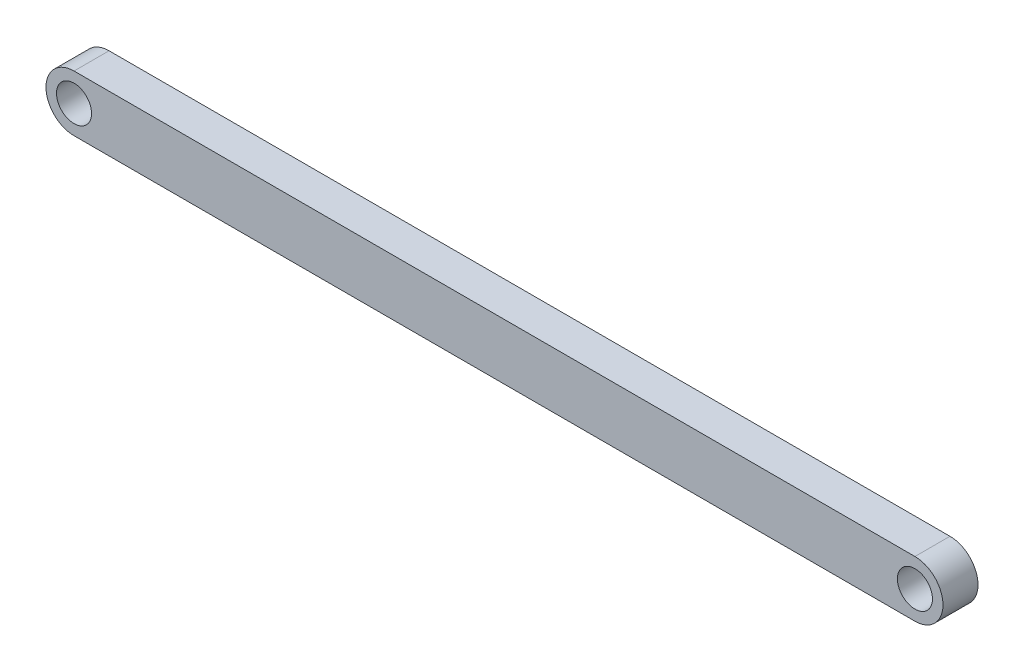
ISO-10303-21;
HEADER;
FILE_DESCRIPTION(('STEP AP214'),'2;1');
FILE_NAME('part.step','',(''),(''),'','','');
FILE_SCHEMA(('AUTOMOTIVE_DESIGN { 1 0 10303 214 1 1 1 1 }'));
ENDSEC;
DATA;
#1=APPLICATION_CONTEXT('core data for automotive mechanical design processes');
#2=APPLICATION_PROTOCOL_DEFINITION('international standard','automotive_design',2000,#1);
#3=PRODUCT_CONTEXT('',#1,'mechanical');
#4=PRODUCT('Part','Part','',(#3));
#5=PRODUCT_RELATED_PRODUCT_CATEGORY('part','',(#4));
#6=PRODUCT_DEFINITION_FORMATION('','',#4);
#7=PRODUCT_DEFINITION_CONTEXT('part definition',#1,'design');
#8=PRODUCT_DEFINITION('design','',#6,#7);
#9=PRODUCT_DEFINITION_SHAPE('','',#8);
#10=(LENGTH_UNIT() NAMED_UNIT(*) SI_UNIT(.MILLI.,.METRE.));
#11=(NAMED_UNIT(*) PLANE_ANGLE_UNIT() SI_UNIT($,.RADIAN.));
#12=(NAMED_UNIT(*) SI_UNIT($,.STERADIAN.) SOLID_ANGLE_UNIT());
#13=UNCERTAINTY_MEASURE_WITH_UNIT(LENGTH_MEASURE(1.E-05),#10,'distance_accuracy_value','');
#14=(GEOMETRIC_REPRESENTATION_CONTEXT(3) GLOBAL_UNCERTAINTY_ASSIGNED_CONTEXT((#13)) GLOBAL_UNIT_ASSIGNED_CONTEXT((#10,
#11,#12)) REPRESENTATION_CONTEXT('',''));
#15=CARTESIAN_POINT('',(0.,0.,0.));
#16=DIRECTION('',(0.,0.,1.));
#17=DIRECTION('',(1.,0.,0.));
#18=AXIS2_PLACEMENT_3D('',#15,#16,#17);
#19=CARTESIAN_POINT('',(0.,0.,10.));
#20=DIRECTION('',(0.,0.,1.));
#21=DIRECTION('',(1.,0.,0.));
#22=AXIS2_PLACEMENT_3D('',#19,#20,#21);
#23=PLANE('',#22);
#24=CARTESIAN_POINT('',(240.,0.,10.));
#25=DIRECTION('',(0.,0.,1.));
#26=DIRECTION('',(1.,0.,0.));
#27=AXIS2_PLACEMENT_3D('',#24,#25,#26);
#28=CIRCLE('',#27,4.99999999999999);
#29=CARTESIAN_POINT('',(245.,0.,10.));
#30=VERTEX_POINT('',#29);
#31=EDGE_CURVE('E104',#30,#30,#28,.T.);
#32=ORIENTED_EDGE('',*,*,#31,.F.);
#33=EDGE_LOOP('',(#32));
#34=FACE_BOUND('',#33,.T.);
#35=CARTESIAN_POINT('',(0.,0.,10.));
#36=DIRECTION('',(0.,0.,1.));
#37=DIRECTION('',(1.,0.,0.));
#38=AXIS2_PLACEMENT_3D('',#35,#36,#37);
#39=CIRCLE('',#38,8.);
#40=CARTESIAN_POINT('',(0.,8.,10.));
#41=VERTEX_POINT('',#40);
#42=CARTESIAN_POINT('',(0.,-8.,10.));
#43=VERTEX_POINT('',#42);
#44=EDGE_CURVE('E89',#41,#43,#39,.T.);
#45=ORIENTED_EDGE('',*,*,#44,.T.);
#46=DIRECTION('',(1.,0.,0.));
#47=VECTOR('',#46,1.);
#48=CARTESIAN_POINT('',(0.,-8.,10.));
#49=LINE('',#48,#47);
#50=CARTESIAN_POINT('',(240.,-8.,10.));
#51=VERTEX_POINT('',#50);
#52=EDGE_CURVE('E84',#43,#51,#49,.T.);
#53=ORIENTED_EDGE('',*,*,#52,.T.);
#54=CARTESIAN_POINT('',(240.,0.,10.));
#55=DIRECTION('',(0.,0.,1.));
#56=DIRECTION('',(1.,0.,0.));
#57=AXIS2_PLACEMENT_3D('',#54,#55,#56);
#58=CIRCLE('',#57,8.);
#59=CARTESIAN_POINT('',(240.,8.,10.));
#60=VERTEX_POINT('',#59);
#61=EDGE_CURVE('E87',#51,#60,#58,.T.);
#62=ORIENTED_EDGE('',*,*,#61,.T.);
#63=DIRECTION('',(-1.,0.,0.));
#64=VECTOR('',#63,1.);
#65=CARTESIAN_POINT('',(0.,8.,10.));
#66=LINE('',#65,#64);
#67=EDGE_CURVE('E54',#60,#41,#66,.T.);
#68=ORIENTED_EDGE('',*,*,#67,.T.);
#69=EDGE_LOOP('',(#45,#53,#62,#68));
#70=FACE_BOUND('',#69,.T.);
#71=CARTESIAN_POINT('',(0.,0.,10.));
#72=DIRECTION('',(0.,0.,1.));
#73=DIRECTION('',(1.,0.,0.));
#74=AXIS2_PLACEMENT_3D('',#71,#72,#73);
#75=CIRCLE('',#74,5.);
#76=CARTESIAN_POINT('',(5.,0.,10.));
#77=VERTEX_POINT('',#76);
#78=EDGE_CURVE('E119',#77,#77,#75,.T.);
#79=ORIENTED_EDGE('',*,*,#78,.F.);
#80=EDGE_LOOP('',(#79));
#81=FACE_BOUND('',#80,.T.);
#82=ADVANCED_FACE('F37',(#34,#70,#81),#23,.T.);
#83=CARTESIAN_POINT('',(0.,0.,0.));
#84=DIRECTION('',(0.,0.,1.));
#85=DIRECTION('',(1.,0.,0.));
#86=AXIS2_PLACEMENT_3D('',#83,#84,#85);
#87=PLANE('',#86);
#88=CARTESIAN_POINT('',(0.,0.,0.));
#89=DIRECTION('',(0.,0.,1.));
#90=DIRECTION('',(1.,0.,0.));
#91=AXIS2_PLACEMENT_3D('',#88,#89,#90);
#92=CIRCLE('',#91,8.);
#93=CARTESIAN_POINT('',(0.,8.,0.));
#94=VERTEX_POINT('',#93);
#95=CARTESIAN_POINT('',(0.,-8.,0.));
#96=VERTEX_POINT('',#95);
#97=EDGE_CURVE('E101',#94,#96,#92,.T.);
#98=ORIENTED_EDGE('',*,*,#97,.F.);
#99=DIRECTION('',(-1.,0.,0.));
#100=VECTOR('',#99,1.);
#101=CARTESIAN_POINT('',(0.,8.,0.));
#102=LINE('',#101,#100);
#103=CARTESIAN_POINT('',(240.,8.,0.));
#104=VERTEX_POINT('',#103);
#105=EDGE_CURVE('E77',#104,#94,#102,.T.);
#106=ORIENTED_EDGE('',*,*,#105,.F.);
#107=CARTESIAN_POINT('',(240.,0.,0.));
#108=DIRECTION('',(0.,0.,1.));
#109=DIRECTION('',(1.,0.,0.));
#110=AXIS2_PLACEMENT_3D('',#107,#108,#109);
#111=CIRCLE('',#110,8.);
#112=CARTESIAN_POINT('',(240.,-8.,0.));
#113=VERTEX_POINT('',#112);
#114=EDGE_CURVE('E71',#113,#104,#111,.T.);
#115=ORIENTED_EDGE('',*,*,#114,.F.);
#116=DIRECTION('',(1.,0.,0.));
#117=VECTOR('',#116,1.);
#118=CARTESIAN_POINT('',(0.,-8.,0.));
#119=LINE('',#118,#117);
#120=EDGE_CURVE('E93',#96,#113,#119,.T.);
#121=ORIENTED_EDGE('',*,*,#120,.F.);
#122=EDGE_LOOP('',(#98,#106,#115,#121));
#123=FACE_BOUND('',#122,.T.);
#124=CARTESIAN_POINT('',(240.,0.,0.));
#125=DIRECTION('',(0.,0.,1.));
#126=DIRECTION('',(1.,0.,0.));
#127=AXIS2_PLACEMENT_3D('',#124,#125,#126);
#128=CIRCLE('',#127,4.99999999999999);
#129=CARTESIAN_POINT('',(245.,0.,0.));
#130=VERTEX_POINT('',#129);
#131=EDGE_CURVE('E116',#130,#130,#128,.T.);
#132=ORIENTED_EDGE('',*,*,#131,.T.);
#133=EDGE_LOOP('',(#132));
#134=FACE_BOUND('',#133,.T.);
#135=CARTESIAN_POINT('',(0.,0.,0.));
#136=DIRECTION('',(0.,0.,1.));
#137=DIRECTION('',(1.,0.,0.));
#138=AXIS2_PLACEMENT_3D('',#135,#136,#137);
#139=CIRCLE('',#138,5.);
#140=CARTESIAN_POINT('',(5.,0.,0.));
#141=VERTEX_POINT('',#140);
#142=EDGE_CURVE('E122',#141,#141,#139,.T.);
#143=ORIENTED_EDGE('',*,*,#142,.T.);
#144=EDGE_LOOP('',(#143));
#145=FACE_BOUND('',#144,.T.);
#146=ADVANCED_FACE('F112',(#123,#134,#145),#87,.F.);
#147=CARTESIAN_POINT('',(0.,0.,10.));
#148=DIRECTION('',(0.,0.,-1.));
#149=DIRECTION('',(-1.,0.,0.));
#150=AXIS2_PLACEMENT_3D('',#147,#148,#149);
#151=CYLINDRICAL_SURFACE('',#150,8.);
#152=ORIENTED_EDGE('',*,*,#97,.T.);
#153=DIRECTION('',(0.,0.,-1.));
#154=VECTOR('',#153,1.);
#155=CARTESIAN_POINT('',(0.,-8.,10.));
#156=LINE('',#155,#154);
#157=EDGE_CURVE('E11',#43,#96,#156,.T.);
#158=ORIENTED_EDGE('',*,*,#157,.F.);
#159=ORIENTED_EDGE('',*,*,#44,.F.);
#160=DIRECTION('',(0.,0.,-1.));
#161=VECTOR('',#160,1.);
#162=CARTESIAN_POINT('',(0.,8.,10.));
#163=LINE('',#162,#161);
#164=EDGE_CURVE('E97',#41,#94,#163,.T.);
#165=ORIENTED_EDGE('',*,*,#164,.T.);
#166=EDGE_LOOP('',(#152,#158,#159,#165));
#167=FACE_BOUND('',#166,.T.);
#168=ADVANCED_FACE('F39',(#167),#151,.T.);
#169=CARTESIAN_POINT('',(0.,-8.,10.));
#170=DIRECTION('',(0.,1.,0.));
#171=DIRECTION('',(0.,0.,1.));
#172=AXIS2_PLACEMENT_3D('',#169,#170,#171);
#173=PLANE('',#172);
#174=ORIENTED_EDGE('',*,*,#120,.T.);
#175=DIRECTION('',(0.,0.,-1.));
#176=VECTOR('',#175,1.);
#177=CARTESIAN_POINT('',(240.,-8.,10.));
#178=LINE('',#177,#176);
#179=EDGE_CURVE('E46',#51,#113,#178,.T.);
#180=ORIENTED_EDGE('',*,*,#179,.F.);
#181=ORIENTED_EDGE('',*,*,#52,.F.);
#182=ORIENTED_EDGE('',*,*,#157,.T.);
#183=EDGE_LOOP('',(#174,#180,#181,#182));
#184=FACE_BOUND('',#183,.T.);
#185=ADVANCED_FACE('F92',(#184),#173,.F.);
#186=CARTESIAN_POINT('',(240.,0.,10.));
#187=DIRECTION('',(0.,0.,-1.));
#188=DIRECTION('',(-1.,0.,0.));
#189=AXIS2_PLACEMENT_3D('',#186,#187,#188);
#190=CYLINDRICAL_SURFACE('',#189,8.);
#191=ORIENTED_EDGE('',*,*,#114,.T.);
#192=DIRECTION('',(0.,0.,-1.));
#193=VECTOR('',#192,1.);
#194=CARTESIAN_POINT('',(240.,8.,10.));
#195=LINE('',#194,#193);
#196=EDGE_CURVE('E94',#60,#104,#195,.T.);
#197=ORIENTED_EDGE('',*,*,#196,.F.);
#198=ORIENTED_EDGE('',*,*,#61,.F.);
#199=ORIENTED_EDGE('',*,*,#179,.T.);
#200=EDGE_LOOP('',(#191,#197,#198,#199));
#201=FACE_BOUND('',#200,.T.);
#202=ADVANCED_FACE('F95',(#201),#190,.T.);
#203=CARTESIAN_POINT('',(0.,8.,10.));
#204=DIRECTION('',(0.,-1.,0.));
#205=DIRECTION('',(0.,0.,-1.));
#206=AXIS2_PLACEMENT_3D('',#203,#204,#205);
#207=PLANE('',#206);
#208=ORIENTED_EDGE('',*,*,#105,.T.);
#209=ORIENTED_EDGE('',*,*,#164,.F.);
#210=ORIENTED_EDGE('',*,*,#67,.F.);
#211=ORIENTED_EDGE('',*,*,#196,.T.);
#212=EDGE_LOOP('',(#208,#209,#210,#211));
#213=FACE_BOUND('',#212,.T.);
#214=ADVANCED_FACE('F109',(#213),#207,.F.);
#215=CARTESIAN_POINT('',(240.,0.,10.));
#216=DIRECTION('',(0.,0.,-1.));
#217=DIRECTION('',(-1.,0.,0.));
#218=AXIS2_PLACEMENT_3D('',#215,#216,#217);
#219=CYLINDRICAL_SURFACE('',#218,4.99999999999999);
#220=ORIENTED_EDGE('',*,*,#31,.T.);
#221=EDGE_LOOP('',(#220));
#222=FACE_BOUND('',#221,.T.);
#223=ORIENTED_EDGE('',*,*,#131,.F.);
#224=EDGE_LOOP('',(#223));
#225=FACE_BOUND('',#224,.T.);
#226=ADVANCED_FACE('F139',(#222,#225),#219,.F.);
#227=CARTESIAN_POINT('',(0.,0.,10.));
#228=DIRECTION('',(0.,0.,-1.));
#229=DIRECTION('',(-1.,0.,0.));
#230=AXIS2_PLACEMENT_3D('',#227,#228,#229);
#231=CYLINDRICAL_SURFACE('',#230,5.);
#232=ORIENTED_EDGE('',*,*,#78,.T.);
#233=EDGE_LOOP('',(#232));
#234=FACE_BOUND('',#233,.T.);
#235=ORIENTED_EDGE('',*,*,#142,.F.);
#236=EDGE_LOOP('',(#235));
#237=FACE_BOUND('',#236,.T.);
#238=ADVANCED_FACE('F128',(#234,#237),#231,.F.);
#239=CLOSED_SHELL('',(#82,#146,#168,#185,#202,#214,#226,#238));
#240=MANIFOLD_SOLID_BREP('B2',#239);
#241=ADVANCED_BREP_SHAPE_REPRESENTATION('',(#18,#240),#14);
#242=SHAPE_DEFINITION_REPRESENTATION(#9,#241);
ENDSEC;
END-ISO-10303-21;
